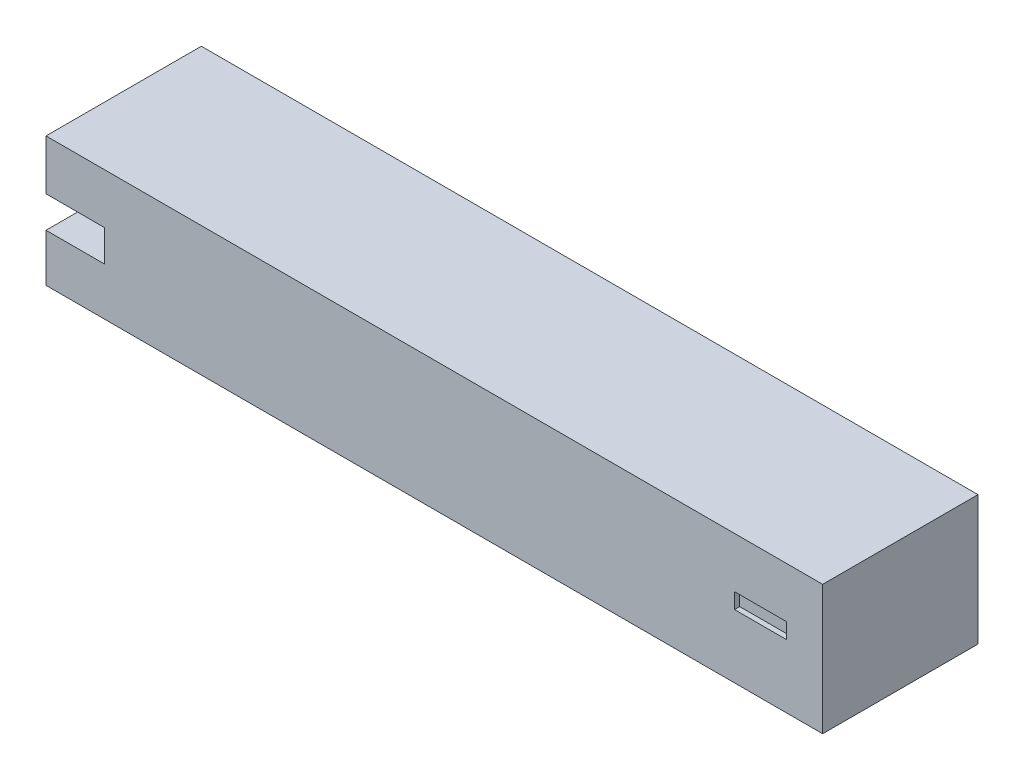
ISO-10303-21;
HEADER;
FILE_DESCRIPTION(('STEP AP214'),'2;1');
FILE_NAME('part.step','',(''),(''),'','','');
FILE_SCHEMA(('AUTOMOTIVE_DESIGN { 1 0 10303 214 1 1 1 1 }'));
ENDSEC;
DATA;
#1=APPLICATION_CONTEXT('core data for automotive mechanical design processes');
#2=APPLICATION_PROTOCOL_DEFINITION('international standard','automotive_design',2000,#1);
#3=PRODUCT_CONTEXT('',#1,'mechanical');
#4=PRODUCT('Part','Part','',(#3));
#5=PRODUCT_RELATED_PRODUCT_CATEGORY('part','',(#4));
#6=PRODUCT_DEFINITION_FORMATION('','',#4);
#7=PRODUCT_DEFINITION_CONTEXT('part definition',#1,'design');
#8=PRODUCT_DEFINITION('design','',#6,#7);
#9=PRODUCT_DEFINITION_SHAPE('','',#8);
#10=(LENGTH_UNIT() NAMED_UNIT(*) SI_UNIT(.MILLI.,.METRE.));
#11=(NAMED_UNIT(*) PLANE_ANGLE_UNIT() SI_UNIT($,.RADIAN.));
#12=(NAMED_UNIT(*) SI_UNIT($,.STERADIAN.) SOLID_ANGLE_UNIT());
#13=UNCERTAINTY_MEASURE_WITH_UNIT(LENGTH_MEASURE(1.E-05),#10,'distance_accuracy_value','');
#14=(GEOMETRIC_REPRESENTATION_CONTEXT(3) GLOBAL_UNCERTAINTY_ASSIGNED_CONTEXT((#13)) GLOBAL_UNIT_ASSIGNED_CONTEXT((#10,
#11,#12)) REPRESENTATION_CONTEXT('',''));
#15=CARTESIAN_POINT('',(0.,0.,0.));
#16=DIRECTION('',(0.,0.,1.));
#17=DIRECTION('',(1.,0.,0.));
#18=AXIS2_PLACEMENT_3D('',#15,#16,#17);
#19=CARTESIAN_POINT('',(0.,0.,60.));
#20=DIRECTION('',(1.,0.,0.));
#21=DIRECTION('',(0.,1.,0.));
#22=AXIS2_PLACEMENT_3D('',#19,#20,#21);
#23=PLANE('',#22);
#24=DIRECTION('',(0.,-1.,0.));
#25=VECTOR('',#24,1.);
#26=CARTESIAN_POINT('',(0.,-19.3736675480984,47.16));
#27=LINE('',#26,#25);
#28=CARTESIAN_POINT('',(0.,-19.3736675480984,47.16));
#29=VERTEX_POINT('',#28);
#30=CARTESIAN_POINT('',(0.,-31.5636675480984,47.16));
#31=VERTEX_POINT('',#30);
#32=EDGE_CURVE('E161',#29,#31,#27,.T.);
#33=ORIENTED_EDGE('',*,*,#32,.F.);
#34=DIRECTION('',(0.,0.,1.));
#35=VECTOR('',#34,1.);
#36=CARTESIAN_POINT('',(0.,-19.3736675480984,47.16));
#37=LINE('',#36,#35);
#38=CARTESIAN_POINT('',(0.,-19.3736675480984,60.));
#39=VERTEX_POINT('',#38);
#40=EDGE_CURVE('E179',#29,#39,#37,.T.);
#41=ORIENTED_EDGE('',*,*,#40,.T.);
#42=DIRECTION('',(0.,-1.,0.));
#43=VECTOR('',#42,1.);
#44=CARTESIAN_POINT('',(0.,0.,60.));
#45=LINE('',#44,#43);
#46=CARTESIAN_POINT('',(0.,0.,60.));
#47=VERTEX_POINT('',#46);
#48=EDGE_CURVE('E188',#47,#39,#45,.T.);
#49=ORIENTED_EDGE('',*,*,#48,.F.);
#50=DIRECTION('',(0.,0.,-1.));
#51=VECTOR('',#50,1.);
#52=CARTESIAN_POINT('',(0.,0.,60.));
#53=LINE('',#52,#51);
#54=CARTESIAN_POINT('',(0.,0.,0.));
#55=VERTEX_POINT('',#54);
#56=EDGE_CURVE('E198',#47,#55,#53,.T.);
#57=ORIENTED_EDGE('',*,*,#56,.T.);
#58=DIRECTION('',(0.,-1.,0.));
#59=VECTOR('',#58,1.);
#60=CARTESIAN_POINT('',(0.,0.,0.));
#61=LINE('',#60,#59);
#62=CARTESIAN_POINT('',(0.,-50.,0.));
#63=VERTEX_POINT('',#62);
#64=EDGE_CURVE('E182',#55,#63,#61,.T.);
#65=ORIENTED_EDGE('',*,*,#64,.T.);
#66=DIRECTION('',(0.,0.,-1.));
#67=VECTOR('',#66,1.);
#68=CARTESIAN_POINT('',(0.,-50.,60.));
#69=LINE('',#68,#67);
#70=CARTESIAN_POINT('',(0.,-50.,60.));
#71=VERTEX_POINT('',#70);
#72=EDGE_CURVE('E11',#71,#63,#69,.T.);
#73=ORIENTED_EDGE('',*,*,#72,.F.);
#74=CARTESIAN_POINT('',(0.,-31.5636675480984,60.));
#75=VERTEX_POINT('',#74);
#76=EDGE_CURVE('E192',#75,#71,#45,.T.);
#77=ORIENTED_EDGE('',*,*,#76,.F.);
#78=DIRECTION('',(0.,0.,1.));
#79=VECTOR('',#78,1.);
#80=CARTESIAN_POINT('',(0.,-31.5636675480984,47.16));
#81=LINE('',#80,#79);
#82=EDGE_CURVE('E55',#31,#75,#81,.T.);
#83=ORIENTED_EDGE('',*,*,#82,.F.);
#84=EDGE_LOOP('',(#33,#41,#49,#57,#65,#73,#77,#83));
#85=FACE_BOUND('',#84,.T.);
#86=ADVANCED_FACE('F33',(#85),#23,.F.);
#87=CARTESIAN_POINT('',(0.,-50.,60.));
#88=DIRECTION('',(0.,1.,0.));
#89=DIRECTION('',(0.,0.,1.));
#90=AXIS2_PLACEMENT_3D('',#87,#88,#89);
#91=PLANE('',#90);
#92=DIRECTION('',(1.,0.,0.));
#93=VECTOR('',#92,1.);
#94=CARTESIAN_POINT('',(0.,-50.,0.));
#95=LINE('',#94,#93);
#96=CARTESIAN_POINT('',(300.,-50.,0.));
#97=VERTEX_POINT('',#96);
#98=EDGE_CURVE('E201',#63,#97,#95,.T.);
#99=ORIENTED_EDGE('',*,*,#98,.T.);
#100=DIRECTION('',(0.,0.,-1.));
#101=VECTOR('',#100,1.);
#102=CARTESIAN_POINT('',(300.,-50.,60.));
#103=LINE('',#102,#101);
#104=CARTESIAN_POINT('',(300.,-50.,60.));
#105=VERTEX_POINT('',#104);
#106=EDGE_CURVE('E40',#105,#97,#103,.T.);
#107=ORIENTED_EDGE('',*,*,#106,.F.);
#108=DIRECTION('',(1.,0.,0.));
#109=VECTOR('',#108,1.);
#110=CARTESIAN_POINT('',(0.,-50.,60.));
#111=LINE('',#110,#109);
#112=EDGE_CURVE('E191',#71,#105,#111,.T.);
#113=ORIENTED_EDGE('',*,*,#112,.F.);
#114=ORIENTED_EDGE('',*,*,#72,.T.);
#115=EDGE_LOOP('',(#99,#107,#113,#114));
#116=FACE_BOUND('',#115,.T.);
#117=ADVANCED_FACE('F237',(#116),#91,.F.);
#118=CARTESIAN_POINT('',(300.,0.,60.));
#119=DIRECTION('',(-1.,0.,0.));
#120=DIRECTION('',(0.,0.,1.));
#121=AXIS2_PLACEMENT_3D('',#118,#119,#120);
#122=PLANE('',#121);
#123=DIRECTION('',(0.,1.,0.));
#124=VECTOR('',#123,1.);
#125=CARTESIAN_POINT('',(300.,0.,0.));
#126=LINE('',#125,#124);
#127=CARTESIAN_POINT('',(300.,0.,0.));
#128=VERTEX_POINT('',#127);
#129=EDGE_CURVE('E203',#97,#128,#126,.T.);
#130=ORIENTED_EDGE('',*,*,#129,.T.);
#131=DIRECTION('',(0.,0.,-1.));
#132=VECTOR('',#131,1.);
#133=CARTESIAN_POINT('',(300.,0.,60.));
#134=LINE('',#133,#132);
#135=CARTESIAN_POINT('',(300.,0.,60.));
#136=VERTEX_POINT('',#135);
#137=EDGE_CURVE('E209',#136,#128,#134,.T.);
#138=ORIENTED_EDGE('',*,*,#137,.F.);
#139=DIRECTION('',(0.,1.,0.));
#140=VECTOR('',#139,1.);
#141=CARTESIAN_POINT('',(300.,0.,60.));
#142=LINE('',#141,#140);
#143=EDGE_CURVE('E194',#105,#136,#142,.T.);
#144=ORIENTED_EDGE('',*,*,#143,.F.);
#145=ORIENTED_EDGE('',*,*,#106,.T.);
#146=EDGE_LOOP('',(#130,#138,#144,#145));
#147=FACE_BOUND('',#146,.T.);
#148=ADVANCED_FACE('F216',(#147),#122,.F.);
#149=CARTESIAN_POINT('',(0.,0.,60.));
#150=DIRECTION('',(0.,-1.,0.));
#151=DIRECTION('',(0.,0.,-1.));
#152=AXIS2_PLACEMENT_3D('',#149,#150,#151);
#153=PLANE('',#152);
#154=DIRECTION('',(-1.,0.,0.));
#155=VECTOR('',#154,1.);
#156=CARTESIAN_POINT('',(0.,0.,0.));
#157=LINE('',#156,#155);
#158=EDGE_CURVE('E205',#128,#55,#157,.T.);
#159=ORIENTED_EDGE('',*,*,#158,.T.);
#160=ORIENTED_EDGE('',*,*,#56,.F.);
#161=DIRECTION('',(-1.,0.,0.));
#162=VECTOR('',#161,1.);
#163=CARTESIAN_POINT('',(0.,0.,60.));
#164=LINE('',#163,#162);
#165=EDGE_CURVE('E196',#136,#47,#164,.T.);
#166=ORIENTED_EDGE('',*,*,#165,.F.);
#167=ORIENTED_EDGE('',*,*,#137,.T.);
#168=EDGE_LOOP('',(#159,#160,#166,#167));
#169=FACE_BOUND('',#168,.T.);
#170=ADVANCED_FACE('F226',(#169),#153,.F.);
#171=CARTESIAN_POINT('',(0.,0.,60.));
#172=DIRECTION('',(0.,0.,1.));
#173=DIRECTION('',(1.,0.,0.));
#174=AXIS2_PLACEMENT_3D('',#171,#172,#173);
#175=PLANE('',#174);
#176=DIRECTION('',(0.,-1.,0.));
#177=VECTOR('',#176,1.);
#178=CARTESIAN_POINT('',(265.959149906875,-19.4796535174715,60.));
#179=LINE('',#178,#177);
#180=CARTESIAN_POINT('',(265.959149906875,-19.4796535174715,60.));
#181=VERTEX_POINT('',#180);
#182=CARTESIAN_POINT('',(265.959149906875,-25.4796535174715,60.));
#183=VERTEX_POINT('',#182);
#184=EDGE_CURVE('E47',#181,#183,#179,.T.);
#185=ORIENTED_EDGE('',*,*,#184,.F.);
#186=DIRECTION('',(-1.,0.,0.));
#187=VECTOR('',#186,1.);
#188=CARTESIAN_POINT('',(265.959149906875,-19.4796535174715,60.));
#189=LINE('',#188,#187);
#190=CARTESIAN_POINT('',(285.959149906875,-19.4796535174715,60.));
#191=VERTEX_POINT('',#190);
#192=EDGE_CURVE('E142',#191,#181,#189,.T.);
#193=ORIENTED_EDGE('',*,*,#192,.F.);
#194=DIRECTION('',(0.,1.,0.));
#195=VECTOR('',#194,1.);
#196=CARTESIAN_POINT('',(285.959149906875,-19.4796535174715,60.));
#197=LINE('',#196,#195);
#198=CARTESIAN_POINT('',(285.959149906875,-25.4796535174715,60.));
#199=VERTEX_POINT('',#198);
#200=EDGE_CURVE('E145',#199,#191,#197,.T.);
#201=ORIENTED_EDGE('',*,*,#200,.F.);
#202=DIRECTION('',(1.,0.,0.));
#203=VECTOR('',#202,1.);
#204=CARTESIAN_POINT('',(265.959149906875,-25.4796535174715,60.));
#205=LINE('',#204,#203);
#206=EDGE_CURVE('E151',#183,#199,#205,.T.);
#207=ORIENTED_EDGE('',*,*,#206,.F.);
#208=EDGE_LOOP('',(#185,#193,#201,#207));
#209=FACE_BOUND('',#208,.T.);
#210=DIRECTION('',(-1.,0.,0.));
#211=VECTOR('',#210,1.);
#212=CARTESIAN_POINT('',(0.,-19.3736675480984,60.));
#213=LINE('',#212,#211);
#214=CARTESIAN_POINT('',(22.63,-19.3736675480984,60.));
#215=VERTEX_POINT('',#214);
#216=EDGE_CURVE('E165',#215,#39,#213,.T.);
#217=ORIENTED_EDGE('',*,*,#216,.F.);
#218=DIRECTION('',(0.,1.,0.));
#219=VECTOR('',#218,1.);
#220=CARTESIAN_POINT('',(22.63,-19.3736675480984,60.));
#221=LINE('',#220,#219);
#222=CARTESIAN_POINT('',(22.63,-31.5636675480984,60.));
#223=VERTEX_POINT('',#222);
#224=EDGE_CURVE('E175',#223,#215,#221,.T.);
#225=ORIENTED_EDGE('',*,*,#224,.F.);
#226=DIRECTION('',(1.,0.,0.));
#227=VECTOR('',#226,1.);
#228=CARTESIAN_POINT('',(0.,-31.5636675480984,60.));
#229=LINE('',#228,#227);
#230=EDGE_CURVE('E157',#75,#223,#229,.T.);
#231=ORIENTED_EDGE('',*,*,#230,.F.);
#232=ORIENTED_EDGE('',*,*,#76,.T.);
#233=ORIENTED_EDGE('',*,*,#112,.T.);
#234=ORIENTED_EDGE('',*,*,#143,.T.);
#235=ORIENTED_EDGE('',*,*,#165,.T.);
#236=ORIENTED_EDGE('',*,*,#48,.T.);
#237=EDGE_LOOP('',(#217,#225,#231,#232,#233,#234,#235,#236));
#238=FACE_BOUND('',#237,.T.);
#239=ADVANCED_FACE('F234',(#209,#238),#175,.T.);
#240=CARTESIAN_POINT('',(0.,0.,0.));
#241=DIRECTION('',(0.,0.,1.));
#242=DIRECTION('',(1.,0.,0.));
#243=AXIS2_PLACEMENT_3D('',#240,#241,#242);
#244=PLANE('',#243);
#245=ORIENTED_EDGE('',*,*,#64,.F.);
#246=ORIENTED_EDGE('',*,*,#158,.F.);
#247=ORIENTED_EDGE('',*,*,#129,.F.);
#248=ORIENTED_EDGE('',*,*,#98,.F.);
#249=EDGE_LOOP('',(#245,#246,#247,#248));
#250=FACE_BOUND('',#249,.T.);
#251=ADVANCED_FACE('F223',(#250),#244,.F.);
#252=CARTESIAN_POINT('',(0.,-19.3736675480984,47.16));
#253=DIRECTION('',(0.,1.,0.));
#254=DIRECTION('',(0.,0.,1.));
#255=AXIS2_PLACEMENT_3D('',#252,#253,#254);
#256=PLANE('',#255);
#257=ORIENTED_EDGE('',*,*,#216,.T.);
#258=ORIENTED_EDGE('',*,*,#40,.F.);
#259=DIRECTION('',(-1.,0.,0.));
#260=VECTOR('',#259,1.);
#261=CARTESIAN_POINT('',(0.,-19.3736675480984,47.16));
#262=LINE('',#261,#260);
#263=CARTESIAN_POINT('',(22.63,-19.3736675480984,47.16));
#264=VERTEX_POINT('',#263);
#265=EDGE_CURVE('E171',#264,#29,#262,.T.);
#266=ORIENTED_EDGE('',*,*,#265,.F.);
#267=DIRECTION('',(0.,0.,1.));
#268=VECTOR('',#267,1.);
#269=CARTESIAN_POINT('',(22.63,-19.3736675480984,47.16));
#270=LINE('',#269,#268);
#271=EDGE_CURVE('E183',#264,#215,#270,.T.);
#272=ORIENTED_EDGE('',*,*,#271,.T.);
#273=EDGE_LOOP('',(#257,#258,#266,#272));
#274=FACE_BOUND('',#273,.T.);
#275=ADVANCED_FACE('F243',(#274),#256,.F.);
#276=CARTESIAN_POINT('',(22.63,-19.3736675480984,47.16));
#277=DIRECTION('',(1.,0.,0.));
#278=DIRECTION('',(0.,0.,-1.));
#279=AXIS2_PLACEMENT_3D('',#276,#277,#278);
#280=PLANE('',#279);
#281=ORIENTED_EDGE('',*,*,#224,.T.);
#282=ORIENTED_EDGE('',*,*,#271,.F.);
#283=DIRECTION('',(0.,1.,0.));
#284=VECTOR('',#283,1.);
#285=CARTESIAN_POINT('',(22.63,-19.3736675480984,47.16));
#286=LINE('',#285,#284);
#287=CARTESIAN_POINT('',(22.63,-31.5636675480984,47.16));
#288=VERTEX_POINT('',#287);
#289=EDGE_CURVE('E168',#288,#264,#286,.T.);
#290=ORIENTED_EDGE('',*,*,#289,.F.);
#291=DIRECTION('',(0.,0.,1.));
#292=VECTOR('',#291,1.);
#293=CARTESIAN_POINT('',(22.63,-31.5636675480984,47.16));
#294=LINE('',#293,#292);
#295=EDGE_CURVE('E185',#288,#223,#294,.T.);
#296=ORIENTED_EDGE('',*,*,#295,.T.);
#297=EDGE_LOOP('',(#281,#282,#290,#296));
#298=FACE_BOUND('',#297,.T.);
#299=ADVANCED_FACE('F245',(#298),#280,.F.);
#300=CARTESIAN_POINT('',(0.,-31.5636675480984,47.16));
#301=DIRECTION('',(0.,-1.,0.));
#302=DIRECTION('',(0.,0.,-1.));
#303=AXIS2_PLACEMENT_3D('',#300,#301,#302);
#304=PLANE('',#303);
#305=ORIENTED_EDGE('',*,*,#230,.T.);
#306=ORIENTED_EDGE('',*,*,#295,.F.);
#307=DIRECTION('',(1.,0.,0.));
#308=VECTOR('',#307,1.);
#309=CARTESIAN_POINT('',(0.,-31.5636675480984,47.16));
#310=LINE('',#309,#308);
#311=EDGE_CURVE('E164',#31,#288,#310,.T.);
#312=ORIENTED_EDGE('',*,*,#311,.F.);
#313=ORIENTED_EDGE('',*,*,#82,.T.);
#314=EDGE_LOOP('',(#305,#306,#312,#313));
#315=FACE_BOUND('',#314,.T.);
#316=ADVANCED_FACE('F246',(#315),#304,.F.);
#317=CARTESIAN_POINT('',(0.,0.,47.16));
#318=DIRECTION('',(0.,0.,1.));
#319=DIRECTION('',(1.,0.,0.));
#320=AXIS2_PLACEMENT_3D('',#317,#318,#319);
#321=PLANE('',#320);
#322=ORIENTED_EDGE('',*,*,#32,.T.);
#323=ORIENTED_EDGE('',*,*,#311,.T.);
#324=ORIENTED_EDGE('',*,*,#289,.T.);
#325=ORIENTED_EDGE('',*,*,#265,.T.);
#326=EDGE_LOOP('',(#322,#323,#324,#325));
#327=FACE_BOUND('',#326,.T.);
#328=ADVANCED_FACE('F239',(#327),#321,.T.);
#329=CARTESIAN_POINT('',(265.959149906875,-19.4796535174715,58.));
#330=DIRECTION('',(-1.,0.,0.));
#331=DIRECTION('',(0.,0.,1.));
#332=AXIS2_PLACEMENT_3D('',#329,#330,#331);
#333=PLANE('',#332);
#334=ORIENTED_EDGE('',*,*,#184,.T.);
#335=DIRECTION('',(0.,0.,1.));
#336=VECTOR('',#335,1.);
#337=CARTESIAN_POINT('',(265.959149906875,-25.4796535174715,58.));
#338=LINE('',#337,#336);
#339=CARTESIAN_POINT('',(265.959149906875,-25.4796535174715,58.));
#340=VERTEX_POINT('',#339);
#341=EDGE_CURVE('E120',#340,#183,#338,.T.);
#342=ORIENTED_EDGE('',*,*,#341,.F.);
#343=DIRECTION('',(0.,-1.,0.));
#344=VECTOR('',#343,1.);
#345=CARTESIAN_POINT('',(265.959149906875,-19.4796535174715,58.));
#346=LINE('',#345,#344);
#347=CARTESIAN_POINT('',(265.959149906875,-19.4796535174715,58.));
#348=VERTEX_POINT('',#347);
#349=EDGE_CURVE('E124',#348,#340,#346,.T.);
#350=ORIENTED_EDGE('',*,*,#349,.F.);
#351=DIRECTION('',(0.,0.,1.));
#352=VECTOR('',#351,1.);
#353=CARTESIAN_POINT('',(265.959149906875,-19.4796535174715,58.));
#354=LINE('',#353,#352);
#355=EDGE_CURVE('E155',#348,#181,#354,.T.);
#356=ORIENTED_EDGE('',*,*,#355,.T.);
#357=EDGE_LOOP('',(#334,#342,#350,#356));
#358=FACE_BOUND('',#357,.T.);
#359=ADVANCED_FACE('F122',(#358),#333,.F.);
#360=CARTESIAN_POINT('',(265.959149906875,-19.4796535174715,58.));
#361=DIRECTION('',(0.,1.,0.));
#362=DIRECTION('',(0.,0.,1.));
#363=AXIS2_PLACEMENT_3D('',#360,#361,#362);
#364=PLANE('',#363);
#365=ORIENTED_EDGE('',*,*,#192,.T.);
#366=ORIENTED_EDGE('',*,*,#355,.F.);
#367=DIRECTION('',(-1.,0.,0.));
#368=VECTOR('',#367,1.);
#369=CARTESIAN_POINT('',(265.959149906875,-19.4796535174715,58.));
#370=LINE('',#369,#368);
#371=CARTESIAN_POINT('',(285.959149906875,-19.4796535174715,58.));
#372=VERTEX_POINT('',#371);
#373=EDGE_CURVE('E130',#372,#348,#370,.T.);
#374=ORIENTED_EDGE('',*,*,#373,.F.);
#375=DIRECTION('',(0.,0.,1.));
#376=VECTOR('',#375,1.);
#377=CARTESIAN_POINT('',(285.959149906875,-19.4796535174715,58.));
#378=LINE('',#377,#376);
#379=EDGE_CURVE('E158',#372,#191,#378,.T.);
#380=ORIENTED_EDGE('',*,*,#379,.T.);
#381=EDGE_LOOP('',(#365,#366,#374,#380));
#382=FACE_BOUND('',#381,.T.);
#383=ADVANCED_FACE('F277',(#382),#364,.F.);
#384=CARTESIAN_POINT('',(285.959149906875,-19.4796535174715,58.));
#385=DIRECTION('',(1.,0.,0.));
#386=DIRECTION('',(0.,0.,-1.));
#387=AXIS2_PLACEMENT_3D('',#384,#385,#386);
#388=PLANE('',#387);
#389=ORIENTED_EDGE('',*,*,#200,.T.);
#390=ORIENTED_EDGE('',*,*,#379,.F.);
#391=DIRECTION('',(0.,1.,0.));
#392=VECTOR('',#391,1.);
#393=CARTESIAN_POINT('',(285.959149906875,-19.4796535174715,58.));
#394=LINE('',#393,#392);
#395=CARTESIAN_POINT('',(285.959149906875,-25.4796535174715,58.));
#396=VERTEX_POINT('',#395);
#397=EDGE_CURVE('E138',#396,#372,#394,.T.);
#398=ORIENTED_EDGE('',*,*,#397,.F.);
#399=DIRECTION('',(0.,0.,1.));
#400=VECTOR('',#399,1.);
#401=CARTESIAN_POINT('',(285.959149906875,-25.4796535174715,58.));
#402=LINE('',#401,#400);
#403=EDGE_CURVE('E129',#396,#199,#402,.T.);
#404=ORIENTED_EDGE('',*,*,#403,.T.);
#405=EDGE_LOOP('',(#389,#390,#398,#404));
#406=FACE_BOUND('',#405,.T.);
#407=ADVANCED_FACE('F275',(#406),#388,.F.);
#408=CARTESIAN_POINT('',(265.959149906875,-25.4796535174715,58.));
#409=DIRECTION('',(0.,-1.,0.));
#410=DIRECTION('',(0.,0.,-1.));
#411=AXIS2_PLACEMENT_3D('',#408,#409,#410);
#412=PLANE('',#411);
#413=ORIENTED_EDGE('',*,*,#206,.T.);
#414=ORIENTED_EDGE('',*,*,#403,.F.);
#415=DIRECTION('',(1.,0.,0.));
#416=VECTOR('',#415,1.);
#417=CARTESIAN_POINT('',(265.959149906875,-25.4796535174715,58.));
#418=LINE('',#417,#416);
#419=EDGE_CURVE('E133',#340,#396,#418,.T.);
#420=ORIENTED_EDGE('',*,*,#419,.F.);
#421=ORIENTED_EDGE('',*,*,#341,.T.);
#422=EDGE_LOOP('',(#413,#414,#420,#421));
#423=FACE_BOUND('',#422,.T.);
#424=ADVANCED_FACE('F134',(#423),#412,.F.);
#425=CARTESIAN_POINT('',(0.,0.,58.));
#426=DIRECTION('',(0.,0.,1.));
#427=DIRECTION('',(1.,0.,0.));
#428=AXIS2_PLACEMENT_3D('',#425,#426,#427);
#429=PLANE('',#428);
#430=ORIENTED_EDGE('',*,*,#349,.T.);
#431=ORIENTED_EDGE('',*,*,#419,.T.);
#432=ORIENTED_EDGE('',*,*,#397,.T.);
#433=ORIENTED_EDGE('',*,*,#373,.T.);
#434=EDGE_LOOP('',(#430,#431,#432,#433));
#435=FACE_BOUND('',#434,.T.);
#436=ADVANCED_FACE('F140',(#435),#429,.T.);
#437=CLOSED_SHELL('',(#86,#117,#148,#170,#239,#251,#275,#299,#316,#328,#359,#383,#407,#424,#436));
#438=MANIFOLD_SOLID_BREP('B2',#437);
#439=ADVANCED_BREP_SHAPE_REPRESENTATION('',(#18,#438),#14);
#440=SHAPE_DEFINITION_REPRESENTATION(#9,#439);
ENDSEC;
END-ISO-10303-21;
